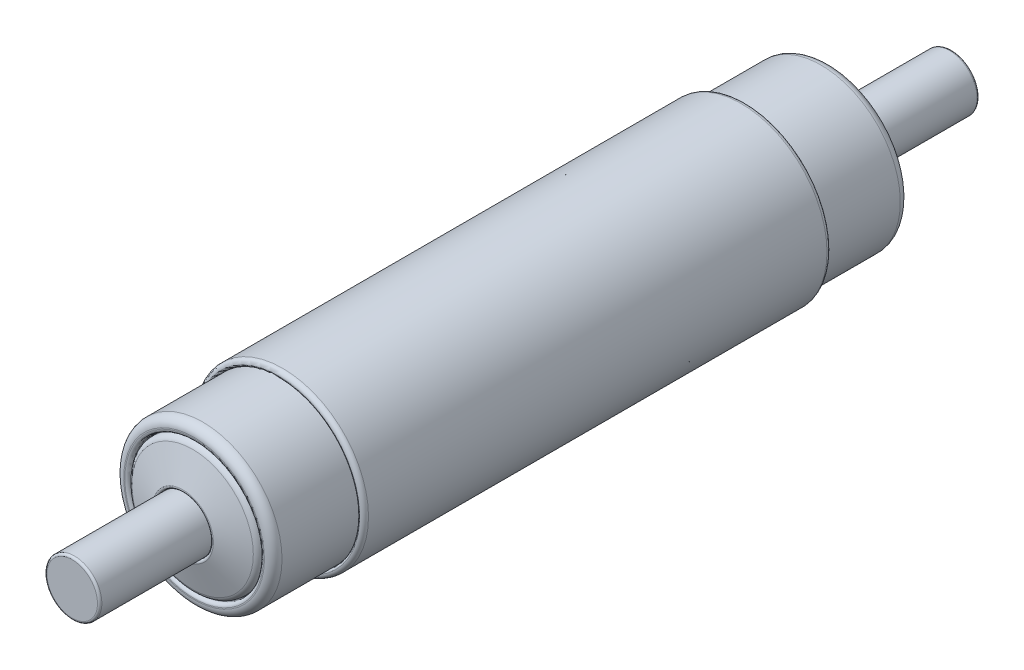
ISO-10303-21;
HEADER;
FILE_DESCRIPTION(('STEP AP214'),'2;1');
FILE_NAME('part.step','',(''),(''),'','','');
FILE_SCHEMA(('AUTOMOTIVE_DESIGN { 1 0 10303 214 1 1 1 1 }'));
ENDSEC;
DATA;
#1=APPLICATION_CONTEXT('core data for automotive mechanical design processes');
#2=APPLICATION_PROTOCOL_DEFINITION('international standard','automotive_design',2000,#1);
#3=PRODUCT_CONTEXT('',#1,'mechanical');
#4=PRODUCT('Part','Part','',(#3));
#5=PRODUCT_RELATED_PRODUCT_CATEGORY('part','',(#4));
#6=PRODUCT_DEFINITION_FORMATION('','',#4);
#7=PRODUCT_DEFINITION_CONTEXT('part definition',#1,'design');
#8=PRODUCT_DEFINITION('design','',#6,#7);
#9=PRODUCT_DEFINITION_SHAPE('','',#8);
#10=(LENGTH_UNIT() NAMED_UNIT(*) SI_UNIT(.MILLI.,.METRE.));
#11=(NAMED_UNIT(*) PLANE_ANGLE_UNIT() SI_UNIT($,.RADIAN.));
#12=(NAMED_UNIT(*) SI_UNIT($,.STERADIAN.) SOLID_ANGLE_UNIT());
#13=UNCERTAINTY_MEASURE_WITH_UNIT(LENGTH_MEASURE(1.E-05),#10,'distance_accuracy_value','');
#14=(GEOMETRIC_REPRESENTATION_CONTEXT(3) GLOBAL_UNCERTAINTY_ASSIGNED_CONTEXT((#13)) GLOBAL_UNIT_ASSIGNED_CONTEXT((#10,
#11,#12)) REPRESENTATION_CONTEXT('',''));
#15=CARTESIAN_POINT('',(0.,0.,0.));
#16=DIRECTION('',(0.,0.,1.));
#17=DIRECTION('',(1.,0.,0.));
#18=AXIS2_PLACEMENT_3D('',#15,#16,#17);
#19=CARTESIAN_POINT('',(0.,0.,36.7225226511455));
#20=DIRECTION('',(0.,0.,-1.));
#21=DIRECTION('',(0.,1.,0.));
#22=AXIS2_PLACEMENT_3D('',#19,#20,#21);
#23=CONICAL_SURFACE('',#22,7.54380000000002,1.26536370769589);
#24=CARTESIAN_POINT('',(0.,0.,37.995831815329));
#25=DIRECTION('',(0.,0.,1.));
#26=DIRECTION('',(0.,-1.,0.));
#27=AXIS2_PLACEMENT_3D('',#24,#25,#26);
#28=CIRCLE('',#27,3.50537927307408);
#29=CARTESIAN_POINT('',(0.,-3.50537927307408,37.995831815329));
#30=VERTEX_POINT('',#29);
#31=EDGE_CURVE('E11',#30,#30,#28,.F.);
#32=ORIENTED_EDGE('',*,*,#31,.T.);
#33=EDGE_LOOP('',(#32));
#34=FACE_BOUND('',#33,.T.);
#35=CARTESIAN_POINT('',(0.,0.,36.8905334513841));
#36=DIRECTION('',(0.,0.,1.));
#37=DIRECTION('',(0.,-1.,0.));
#38=AXIS2_PLACEMENT_3D('',#35,#36,#37);
#39=CIRCLE('',#38,7.01093781922228);
#40=CARTESIAN_POINT('',(0.,-7.01093781922227,36.8905334513841));
#41=VERTEX_POINT('',#40);
#42=EDGE_CURVE('E76',#41,#41,#39,.T.);
#43=ORIENTED_EDGE('',*,*,#42,.T.);
#44=EDGE_LOOP('',(#43));
#45=FACE_BOUND('',#44,.T.);
#46=ADVANCED_FACE('F50',(#34,#45),#23,.T.);
#47=CARTESIAN_POINT('',(0.,0.,50.8));
#48=DIRECTION('',(0.,0.,1.));
#49=DIRECTION('',(0.,-1.,0.));
#50=AXIS2_PLACEMENT_3D('',#47,#48,#49);
#51=CYLINDRICAL_SURFACE('',#50,7.54380000000002);
#52=CARTESIAN_POINT('',(0.,0.,-36.163801134914));
#53=DIRECTION('',(0.,0.,-1.));
#54=DIRECTION('',(0.,1.,0.));
#55=AXIS2_PLACEMENT_3D('',#52,#53,#54);
#56=CIRCLE('',#55,7.54380000000002);
#57=CARTESIAN_POINT('',(0.,7.54380000000003,-36.163801134914));
#58=VERTEX_POINT('',#57);
#59=EDGE_CURVE('E84',#58,#58,#56,.F.);
#60=ORIENTED_EDGE('',*,*,#59,.T.);
#61=EDGE_LOOP('',(#60));
#62=FACE_BOUND('',#61,.T.);
#63=CARTESIAN_POINT('',(0.,0.,36.163801134914));
#64=DIRECTION('',(0.,0.,-1.));
#65=DIRECTION('',(0.,1.,0.));
#66=AXIS2_PLACEMENT_3D('',#63,#64,#65);
#67=CIRCLE('',#66,7.54380000000002);
#68=CARTESIAN_POINT('',(0.,7.54380000000002,36.163801134914));
#69=VERTEX_POINT('',#68);
#70=EDGE_CURVE('E88',#69,#69,#67,.T.);
#71=ORIENTED_EDGE('',*,*,#70,.T.);
#72=EDGE_LOOP('',(#71));
#73=FACE_BOUND('',#72,.T.);
#74=ADVANCED_FACE('F94',(#62,#73),#51,.T.);
#75=CARTESIAN_POINT('',(0.,0.,-38.1));
#76=DIRECTION('',(0.,0.,1.));
#77=DIRECTION('',(0.,-1.,0.));
#78=AXIS2_PLACEMENT_3D('',#75,#76,#77);
#79=CONICAL_SURFACE('',#78,3.175,1.26536370769589);
#80=CARTESIAN_POINT('',(0.,0.,-37.995831815329));
#81=DIRECTION('',(0.,0.,-1.));
#82=DIRECTION('',(0.,1.,0.));
#83=AXIS2_PLACEMENT_3D('',#80,#81,#82);
#84=CIRCLE('',#83,3.50537927307408);
#85=CARTESIAN_POINT('',(0.,3.50537927307409,-37.995831815329));
#86=VERTEX_POINT('',#85);
#87=EDGE_CURVE('E70',#86,#86,#84,.F.);
#88=ORIENTED_EDGE('',*,*,#87,.T.);
#89=EDGE_LOOP('',(#88));
#90=FACE_BOUND('',#89,.T.);
#91=CARTESIAN_POINT('',(0.,0.,-36.8905334513841));
#92=DIRECTION('',(0.,0.,-1.));
#93=DIRECTION('',(0.,1.,0.));
#94=AXIS2_PLACEMENT_3D('',#91,#92,#93);
#95=CIRCLE('',#94,7.01093781922228);
#96=CARTESIAN_POINT('',(0.,7.01093781922229,-36.8905334513841));
#97=VERTEX_POINT('',#96);
#98=EDGE_CURVE('E80',#97,#97,#95,.T.);
#99=ORIENTED_EDGE('',*,*,#98,.T.);
#100=EDGE_LOOP('',(#99));
#101=FACE_BOUND('',#100,.T.);
#102=ADVANCED_FACE('F109',(#90,#101),#79,.T.);
#103=CARTESIAN_POINT('',(0.,0.,50.8));
#104=DIRECTION('',(0.,0.,1.));
#105=DIRECTION('',(0.,-1.,0.));
#106=AXIS2_PLACEMENT_3D('',#103,#104,#105);
#107=CYLINDRICAL_SURFACE('',#106,3.175);
#108=CARTESIAN_POINT('',(0.,0.,-37.753587709839));
#109=DIRECTION('',(0.,0.,-1.));
#110=DIRECTION('',(0.,1.,0.));
#111=AXIS2_PLACEMENT_3D('',#108,#109,#110);
#112=CIRCLE('',#111,3.175);
#113=CARTESIAN_POINT('',(0.,3.17500000000001,-37.753587709839));
#114=VERTEX_POINT('',#113);
#115=EDGE_CURVE('E58',#114,#114,#112,.T.);
#116=ORIENTED_EDGE('',*,*,#115,.T.);
#117=EDGE_LOOP('',(#116));
#118=FACE_BOUND('',#117,.T.);
#119=CARTESIAN_POINT('',(0.,0.,37.753587709839));
#120=DIRECTION('',(0.,0.,-1.));
#121=DIRECTION('',(0.,1.,0.));
#122=AXIS2_PLACEMENT_3D('',#119,#120,#121);
#123=CIRCLE('',#122,3.175);
#124=CARTESIAN_POINT('',(0.,3.175,37.753587709839));
#125=VERTEX_POINT('',#124);
#126=EDGE_CURVE('E64',#125,#125,#123,.F.);
#127=ORIENTED_EDGE('',*,*,#126,.T.);
#128=EDGE_LOOP('',(#127));
#129=FACE_BOUND('',#128,.T.);
#130=ADVANCED_FACE('F115',(#118,#129),#107,.F.);
#131=CARTESIAN_POINT('',(0.,0.,-36.163801134914));
#132=DIRECTION('',(0.,0.,-1.));
#133=DIRECTION('',(0.,1.,0.));
#134=AXIS2_PLACEMENT_3D('',#131,#132,#133);
#135=TOROIDAL_SURFACE('',#134,6.78180000000002,0.762);
#136=ORIENTED_EDGE('',*,*,#98,.F.);
#137=EDGE_LOOP('',(#136));
#138=FACE_BOUND('',#137,.T.);
#139=ORIENTED_EDGE('',*,*,#59,.F.);
#140=EDGE_LOOP('',(#139));
#141=FACE_BOUND('',#140,.T.);
#142=ADVANCED_FACE('F100',(#138,#141),#135,.T.);
#143=CARTESIAN_POINT('',(0.,0.,36.163801134914));
#144=DIRECTION('',(0.,0.,-1.));
#145=DIRECTION('',(0.,1.,0.));
#146=AXIS2_PLACEMENT_3D('',#143,#144,#145);
#147=TOROIDAL_SURFACE('',#146,6.78180000000002,0.762);
#148=ORIENTED_EDGE('',*,*,#70,.F.);
#149=EDGE_LOOP('',(#148));
#150=FACE_BOUND('',#149,.T.);
#151=ORIENTED_EDGE('',*,*,#42,.F.);
#152=EDGE_LOOP('',(#151));
#153=FACE_BOUND('',#152,.T.);
#154=ADVANCED_FACE('F96',(#150,#153),#147,.T.);
#155=CARTESIAN_POINT('',(0.,0.,-37.753587709839));
#156=DIRECTION('',(0.,0.,-1.));
#157=DIRECTION('',(0.,1.,0.));
#158=AXIS2_PLACEMENT_3D('',#155,#156,#157);
#159=TOROIDAL_SURFACE('',#158,3.429,0.254);
#160=ORIENTED_EDGE('',*,*,#115,.F.);
#161=EDGE_LOOP('',(#160));
#162=FACE_BOUND('',#161,.T.);
#163=ORIENTED_EDGE('',*,*,#87,.F.);
#164=EDGE_LOOP('',(#163));
#165=FACE_BOUND('',#164,.T.);
#166=ADVANCED_FACE('F99',(#162,#165),#159,.T.);
#167=CARTESIAN_POINT('',(0.,0.,37.753587709839));
#168=DIRECTION('',(0.,0.,-1.));
#169=DIRECTION('',(0.,1.,0.));
#170=AXIS2_PLACEMENT_3D('',#167,#168,#169);
#171=TOROIDAL_SURFACE('',#170,3.429,0.254);
#172=ORIENTED_EDGE('',*,*,#31,.F.);
#173=EDGE_LOOP('',(#172));
#174=FACE_BOUND('',#173,.T.);
#175=ORIENTED_EDGE('',*,*,#126,.F.);
#176=EDGE_LOOP('',(#175));
#177=FACE_BOUND('',#176,.T.);
#178=ADVANCED_FACE('F52',(#174,#177),#171,.T.);
#179=CLOSED_SHELL('',(#46,#74,#102,#130,#142,#154,#166,#178));
#180=MANIFOLD_SOLID_BREP('B2',#179);
#181=CARTESIAN_POINT('',(0.,7.62000000000003,-36.7225226511455));
#182=DIRECTION('',(0.,0.,1.));
#183=DIRECTION('',(0.,-1.,0.));
#184=AXIS2_PLACEMENT_3D('',#181,#182,#183);
#185=PLANE('',#184);
#186=CARTESIAN_POINT('',(0.,0.,-36.7225226511455));
#187=DIRECTION('',(0.,0.,1.));
#188=DIRECTION('',(0.,-1.,0.));
#189=AXIS2_PLACEMENT_3D('',#186,#187,#188);
#190=CIRCLE('',#189,8.00100000000002);
#191=CARTESIAN_POINT('',(0.,-8.00100000000001,-36.7225226511455));
#192=VERTEX_POINT('',#191);
#193=EDGE_CURVE('E49',#192,#192,#190,.T.);
#194=ORIENTED_EDGE('',*,*,#193,.T.);
#195=EDGE_LOOP('',(#194));
#196=FACE_BOUND('',#195,.T.);
#197=CARTESIAN_POINT('',(0.,0.,-36.7225226511455));
#198=DIRECTION('',(0.,0.,1.));
#199=DIRECTION('',(0.,-1.,0.));
#200=AXIS2_PLACEMENT_3D('',#197,#198,#199);
#201=CIRCLE('',#200,8.12800000000003);
#202=CARTESIAN_POINT('',(0.,-8.12800000000002,-36.7225226511455));
#203=VERTEX_POINT('',#202);
#204=EDGE_CURVE('E226',#203,#203,#201,.F.);
#205=ORIENTED_EDGE('',*,*,#204,.T.);
#206=EDGE_LOOP('',(#205));
#207=FACE_BOUND('',#206,.T.);
#208=ADVANCED_FACE('F196',(#196,#207),#185,.F.);
#209=CARTESIAN_POINT('',(0.,0.,50.8));
#210=DIRECTION('',(0.,0.,1.));
#211=DIRECTION('',(0.,-1.,0.));
#212=AXIS2_PLACEMENT_3D('',#209,#210,#211);
#213=CYLINDRICAL_SURFACE('',#212,9.14400000000003);
#214=CARTESIAN_POINT('',(0.,0.,-35.7065226511455));
#215=DIRECTION('',(0.,0.,1.));
#216=DIRECTION('',(0.,-1.,0.));
#217=AXIS2_PLACEMENT_3D('',#214,#215,#216);
#218=CIRCLE('',#217,9.14400000000003);
#219=CARTESIAN_POINT('',(0.,-9.14400000000002,-35.7065226511455));
#220=VERTEX_POINT('',#219);
#221=EDGE_CURVE('E230',#220,#220,#218,.T.);
#222=ORIENTED_EDGE('',*,*,#221,.T.);
#223=EDGE_LOOP('',(#222));
#224=FACE_BOUND('',#223,.T.);
#225=CARTESIAN_POINT('',(0.,0.,35.7065226511455));
#226=DIRECTION('',(0.,0.,-1.));
#227=DIRECTION('',(0.,1.,0.));
#228=AXIS2_PLACEMENT_3D('',#225,#226,#227);
#229=CIRCLE('',#228,9.14400000000003);
#230=CARTESIAN_POINT('',(0.,9.14400000000003,35.7065226511455));
#231=VERTEX_POINT('',#230);
#232=EDGE_CURVE('E234',#231,#231,#229,.T.);
#233=ORIENTED_EDGE('',*,*,#232,.T.);
#234=EDGE_LOOP('',(#233));
#235=FACE_BOUND('',#234,.T.);
#236=ADVANCED_FACE('F240',(#224,#235),#213,.T.);
#237=CARTESIAN_POINT('',(0.,9.14400000000003,36.7225226511455));
#238=DIRECTION('',(0.,0.,-1.));
#239=DIRECTION('',(0.,1.,0.));
#240=AXIS2_PLACEMENT_3D('',#237,#238,#239);
#241=PLANE('',#240);
#242=CARTESIAN_POINT('',(0.,0.,36.7225226511455));
#243=DIRECTION('',(0.,0.,-1.));
#244=DIRECTION('',(0.,1.,0.));
#245=AXIS2_PLACEMENT_3D('',#242,#243,#244);
#246=CIRCLE('',#245,8.00100000000002);
#247=CARTESIAN_POINT('',(0.,8.00100000000002,36.7225226511455));
#248=VERTEX_POINT('',#247);
#249=EDGE_CURVE('E204',#248,#248,#246,.T.);
#250=ORIENTED_EDGE('',*,*,#249,.T.);
#251=EDGE_LOOP('',(#250));
#252=FACE_BOUND('',#251,.T.);
#253=CARTESIAN_POINT('',(0.,0.,36.7225226511455));
#254=DIRECTION('',(0.,0.,-1.));
#255=DIRECTION('',(0.,1.,0.));
#256=AXIS2_PLACEMENT_3D('',#253,#254,#255);
#257=CIRCLE('',#256,8.12800000000003);
#258=CARTESIAN_POINT('',(0.,8.12800000000003,36.7225226511455));
#259=VERTEX_POINT('',#258);
#260=EDGE_CURVE('E222',#259,#259,#257,.F.);
#261=ORIENTED_EDGE('',*,*,#260,.T.);
#262=EDGE_LOOP('',(#261));
#263=FACE_BOUND('',#262,.T.);
#264=ADVANCED_FACE('F250',(#252,#263),#241,.F.);
#265=CARTESIAN_POINT('',(0.,0.,50.8));
#266=DIRECTION('',(0.,0.,1.));
#267=DIRECTION('',(0.,-1.,0.));
#268=AXIS2_PLACEMENT_3D('',#265,#266,#267);
#269=CYLINDRICAL_SURFACE('',#268,7.62000000000002);
#270=CARTESIAN_POINT('',(0.,0.,36.3415226511455));
#271=DIRECTION('',(0.,0.,-1.));
#272=DIRECTION('',(0.,1.,0.));
#273=AXIS2_PLACEMENT_3D('',#270,#271,#272);
#274=CIRCLE('',#273,7.62000000000002);
#275=CARTESIAN_POINT('',(0.,7.62000000000002,36.3415226511455));
#276=VERTEX_POINT('',#275);
#277=EDGE_CURVE('E210',#276,#276,#274,.F.);
#278=ORIENTED_EDGE('',*,*,#277,.T.);
#279=EDGE_LOOP('',(#278));
#280=FACE_BOUND('',#279,.T.);
#281=CARTESIAN_POINT('',(0.,0.,-36.3415226511455));
#282=DIRECTION('',(0.,0.,1.));
#283=DIRECTION('',(0.,-1.,0.));
#284=AXIS2_PLACEMENT_3D('',#281,#282,#283);
#285=CIRCLE('',#284,7.62000000000002);
#286=CARTESIAN_POINT('',(0.,-7.62000000000001,-36.3415226511455));
#287=VERTEX_POINT('',#286);
#288=EDGE_CURVE('E216',#287,#287,#285,.F.);
#289=ORIENTED_EDGE('',*,*,#288,.T.);
#290=EDGE_LOOP('',(#289));
#291=FACE_BOUND('',#290,.T.);
#292=ADVANCED_FACE('F252',(#280,#291),#269,.F.);
#293=CARTESIAN_POINT('',(0.,0.,-35.7065226511455));
#294=DIRECTION('',(0.,0.,1.));
#295=DIRECTION('',(0.,-1.,0.));
#296=AXIS2_PLACEMENT_3D('',#293,#294,#295);
#297=TOROIDAL_SURFACE('',#296,8.12800000000003,1.016);
#298=ORIENTED_EDGE('',*,*,#204,.F.);
#299=EDGE_LOOP('',(#298));
#300=FACE_BOUND('',#299,.T.);
#301=ORIENTED_EDGE('',*,*,#221,.F.);
#302=EDGE_LOOP('',(#301));
#303=FACE_BOUND('',#302,.T.);
#304=ADVANCED_FACE('F246',(#300,#303),#297,.T.);
#305=CARTESIAN_POINT('',(0.,0.,35.7065226511455));
#306=DIRECTION('',(0.,0.,-1.));
#307=DIRECTION('',(0.,1.,0.));
#308=AXIS2_PLACEMENT_3D('',#305,#306,#307);
#309=TOROIDAL_SURFACE('',#308,8.12800000000003,1.016);
#310=ORIENTED_EDGE('',*,*,#232,.F.);
#311=EDGE_LOOP('',(#310));
#312=FACE_BOUND('',#311,.T.);
#313=ORIENTED_EDGE('',*,*,#260,.F.);
#314=EDGE_LOOP('',(#313));
#315=FACE_BOUND('',#314,.T.);
#316=ADVANCED_FACE('F242',(#312,#315),#309,.T.);
#317=CARTESIAN_POINT('',(0.,0.,36.3415226511455));
#318=DIRECTION('',(0.,0.,-1.));
#319=DIRECTION('',(0.,1.,0.));
#320=AXIS2_PLACEMENT_3D('',#317,#318,#319);
#321=TOROIDAL_SURFACE('',#320,8.00100000000002,0.381);
#322=ORIENTED_EDGE('',*,*,#249,.F.);
#323=EDGE_LOOP('',(#322));
#324=FACE_BOUND('',#323,.T.);
#325=ORIENTED_EDGE('',*,*,#277,.F.);
#326=EDGE_LOOP('',(#325));
#327=FACE_BOUND('',#326,.T.);
#328=ADVANCED_FACE('F245',(#324,#327),#321,.T.);
#329=CARTESIAN_POINT('',(0.,0.,-36.3415226511455));
#330=DIRECTION('',(0.,0.,1.));
#331=DIRECTION('',(0.,-1.,0.));
#332=AXIS2_PLACEMENT_3D('',#329,#330,#331);
#333=TOROIDAL_SURFACE('',#332,8.00100000000002,0.381);
#334=ORIENTED_EDGE('',*,*,#288,.F.);
#335=EDGE_LOOP('',(#334));
#336=FACE_BOUND('',#335,.T.);
#337=ORIENTED_EDGE('',*,*,#193,.F.);
#338=EDGE_LOOP('',(#337));
#339=FACE_BOUND('',#338,.T.);
#340=ADVANCED_FACE('F198',(#336,#339),#333,.T.);
#341=CLOSED_SHELL('',(#208,#236,#264,#292,#304,#316,#328,#340));
#342=MANIFOLD_SOLID_BREP('B6',#341);
#343=CARTESIAN_POINT('',(0.,0.,50.8));
#344=DIRECTION('',(0.,0.,1.));
#345=DIRECTION('',(1.,0.,0.));
#346=AXIS2_PLACEMENT_3D('',#343,#344,#345);
#347=CYLINDRICAL_SURFACE('',#346,9.14400000000002);
#348=CARTESIAN_POINT('',(0.,0.,26.7335));
#349=DIRECTION('',(0.,0.,-1.));
#350=DIRECTION('',(-1.,0.,0.));
#351=AXIS2_PLACEMENT_3D('',#348,#349,#350);
#352=CIRCLE('',#351,9.14400000000002);
#353=CARTESIAN_POINT('',(-9.14400000000002,0.,26.7335));
#354=VERTEX_POINT('',#353);
#355=EDGE_CURVE('E195',#354,#354,#352,.F.);
#356=ORIENTED_EDGE('',*,*,#355,.T.);
#357=EDGE_LOOP('',(#356));
#358=FACE_BOUND('',#357,.T.);
#359=CARTESIAN_POINT('',(0.,0.,-26.7335));
#360=DIRECTION('',(0.,0.,1.));
#361=DIRECTION('',(1.,0.,0.));
#362=AXIS2_PLACEMENT_3D('',#359,#360,#361);
#363=CIRCLE('',#362,9.14400000000002);
#364=CARTESIAN_POINT('',(9.14400000000002,0.,-26.7335));
#365=VERTEX_POINT('',#364);
#366=EDGE_CURVE('E349',#365,#365,#363,.F.);
#367=ORIENTED_EDGE('',*,*,#366,.T.);
#368=EDGE_LOOP('',(#367));
#369=FACE_BOUND('',#368,.T.);
#370=ADVANCED_FACE('F341',(#358,#369),#347,.F.);
#371=CARTESIAN_POINT('',(0.,0.,50.8));
#372=DIRECTION('',(0.,0.,1.));
#373=DIRECTION('',(1.,0.,0.));
#374=AXIS2_PLACEMENT_3D('',#371,#372,#373);
#375=CYLINDRICAL_SURFACE('',#374,9.90599999999998);
#376=CARTESIAN_POINT('',(0.,0.,-26.4795));
#377=DIRECTION('',(0.,0.,1.));
#378=DIRECTION('',(1.,0.,0.));
#379=AXIS2_PLACEMENT_3D('',#376,#377,#378);
#380=CIRCLE('',#379,9.90599999999998);
#381=CARTESIAN_POINT('',(9.90599999999998,0.,-26.4795));
#382=VERTEX_POINT('',#381);
#383=EDGE_CURVE('E367',#382,#382,#380,.T.);
#384=ORIENTED_EDGE('',*,*,#383,.T.);
#385=EDGE_LOOP('',(#384));
#386=FACE_BOUND('',#385,.T.);
#387=CARTESIAN_POINT('',(0.,0.,26.4795));
#388=DIRECTION('',(0.,0.,-1.));
#389=DIRECTION('',(-1.,0.,0.));
#390=AXIS2_PLACEMENT_3D('',#387,#388,#389);
#391=CIRCLE('',#390,9.90599999999998);
#392=CARTESIAN_POINT('',(-9.90599999999998,0.,26.4795));
#393=VERTEX_POINT('',#392);
#394=EDGE_CURVE('E371',#393,#393,#391,.T.);
#395=ORIENTED_EDGE('',*,*,#394,.T.);
#396=EDGE_LOOP('',(#395));
#397=FACE_BOUND('',#396,.T.);
#398=ADVANCED_FACE('F377',(#386,#397),#375,.T.);
#399=CARTESIAN_POINT('',(0.,0.,-26.4795));
#400=DIRECTION('',(0.,0.,1.));
#401=DIRECTION('',(1.,0.,0.));
#402=AXIS2_PLACEMENT_3D('',#399,#400,#401);
#403=TOROIDAL_SURFACE('',#402,9.39799999999998,0.508);
#404=CARTESIAN_POINT('',(0.,0.,-26.9875));
#405=DIRECTION('',(0.,0.,1.));
#406=DIRECTION('',(1.,0.,0.));
#407=AXIS2_PLACEMENT_3D('',#404,#405,#406);
#408=CIRCLE('',#407,9.39799999999998);
#409=CARTESIAN_POINT('',(9.39799999999998,0.,-26.9875));
#410=VERTEX_POINT('',#409);
#411=EDGE_CURVE('E361',#410,#410,#408,.F.);
#412=ORIENTED_EDGE('',*,*,#411,.F.);
#413=EDGE_LOOP('',(#412));
#414=FACE_BOUND('',#413,.T.);
#415=ORIENTED_EDGE('',*,*,#383,.F.);
#416=EDGE_LOOP('',(#415));
#417=FACE_BOUND('',#416,.T.);
#418=ADVANCED_FACE('F383',(#414,#417),#403,.T.);
#419=CARTESIAN_POINT('',(0.,0.,26.4795));
#420=DIRECTION('',(0.,0.,-1.));
#421=DIRECTION('',(-1.,0.,0.));
#422=AXIS2_PLACEMENT_3D('',#419,#420,#421);
#423=TOROIDAL_SURFACE('',#422,9.39799999999998,0.508);
#424=ORIENTED_EDGE('',*,*,#394,.F.);
#425=EDGE_LOOP('',(#424));
#426=FACE_BOUND('',#425,.T.);
#427=CARTESIAN_POINT('',(0.,0.,26.9875));
#428=DIRECTION('',(0.,0.,-1.));
#429=DIRECTION('',(-1.,0.,0.));
#430=AXIS2_PLACEMENT_3D('',#427,#428,#429);
#431=CIRCLE('',#430,9.39799999999998);
#432=CARTESIAN_POINT('',(-9.39799999999998,0.,26.9875));
#433=VERTEX_POINT('',#432);
#434=EDGE_CURVE('E355',#433,#433,#431,.F.);
#435=ORIENTED_EDGE('',*,*,#434,.F.);
#436=EDGE_LOOP('',(#435));
#437=FACE_BOUND('',#436,.T.);
#438=ADVANCED_FACE('F379',(#426,#437),#423,.T.);
#439=CARTESIAN_POINT('',(0.,0.,26.7335));
#440=DIRECTION('',(0.,0.,-1.));
#441=DIRECTION('',(-1.,0.,0.));
#442=AXIS2_PLACEMENT_3D('',#439,#440,#441);
#443=TOROIDAL_SURFACE('',#442,9.39800000000002,0.254);
#444=ORIENTED_EDGE('',*,*,#434,.T.);
#445=EDGE_LOOP('',(#444));
#446=FACE_BOUND('',#445,.T.);
#447=ORIENTED_EDGE('',*,*,#355,.F.);
#448=EDGE_LOOP('',(#447));
#449=FACE_BOUND('',#448,.T.);
#450=ADVANCED_FACE('F382',(#446,#449),#443,.T.);
#451=CARTESIAN_POINT('',(0.,0.,-26.7335));
#452=DIRECTION('',(0.,0.,1.));
#453=DIRECTION('',(1.,0.,0.));
#454=AXIS2_PLACEMENT_3D('',#451,#452,#453);
#455=TOROIDAL_SURFACE('',#454,9.39800000000002,0.254);
#456=ORIENTED_EDGE('',*,*,#366,.F.);
#457=EDGE_LOOP('',(#456));
#458=FACE_BOUND('',#457,.T.);
#459=ORIENTED_EDGE('',*,*,#411,.T.);
#460=EDGE_LOOP('',(#459));
#461=FACE_BOUND('',#460,.T.);
#462=ADVANCED_FACE('F343',(#458,#461),#455,.T.);
#463=CLOSED_SHELL('',(#370,#398,#418,#438,#450,#462));
#464=MANIFOLD_SOLID_BREP('B44',#463);
#465=CARTESIAN_POINT('',(0.,3.175,50.8));
#466=DIRECTION('',(0.,0.,-1.));
#467=DIRECTION('',(-1.,0.,0.));
#468=AXIS2_PLACEMENT_3D('',#465,#466,#467);
#469=PLANE('',#468);
#470=CARTESIAN_POINT('',(0.,0.,50.8));
#471=DIRECTION('',(0.,0.,-1.));
#472=DIRECTION('',(-1.,0.,0.));
#473=AXIS2_PLACEMENT_3D('',#470,#471,#472);
#474=CIRCLE('',#473,2.92099999999999);
#475=CARTESIAN_POINT('',(-2.92099999999999,0.,50.8));
#476=VERTEX_POINT('',#475);
#477=EDGE_CURVE('E340',#476,#476,#474,.F.);
#478=ORIENTED_EDGE('',*,*,#477,.T.);
#479=EDGE_LOOP('',(#478));
#480=FACE_BOUND('',#479,.T.);
#481=ADVANCED_FACE('F445',(#480),#469,.F.);
#482=CARTESIAN_POINT('',(0.,3.175,-50.8));
#483=DIRECTION('',(0.,0.,1.));
#484=DIRECTION('',(1.,0.,0.));
#485=AXIS2_PLACEMENT_3D('',#482,#483,#484);
#486=PLANE('',#485);
#487=CARTESIAN_POINT('',(0.,0.,-50.8));
#488=DIRECTION('',(0.,0.,1.));
#489=DIRECTION('',(1.,0.,0.));
#490=AXIS2_PLACEMENT_3D('',#487,#488,#489);
#491=CIRCLE('',#490,2.92099999999999);
#492=CARTESIAN_POINT('',(2.92099999999999,0.,-50.8));
#493=VERTEX_POINT('',#492);
#494=EDGE_CURVE('E453',#493,#493,#491,.F.);
#495=ORIENTED_EDGE('',*,*,#494,.T.);
#496=EDGE_LOOP('',(#495));
#497=FACE_BOUND('',#496,.T.);
#498=ADVANCED_FACE('F483',(#497),#486,.F.);
#499=CARTESIAN_POINT('',(0.,0.,50.8));
#500=DIRECTION('',(0.,0.,1.));
#501=DIRECTION('',(1.,0.,0.));
#502=AXIS2_PLACEMENT_3D('',#499,#500,#501);
#503=CYLINDRICAL_SURFACE('',#502,3.17499999999999);
#504=CARTESIAN_POINT('',(0.,0.,-50.546));
#505=DIRECTION('',(0.,0.,1.));
#506=DIRECTION('',(1.,0.,0.));
#507=AXIS2_PLACEMENT_3D('',#504,#505,#506);
#508=CIRCLE('',#507,3.17499999999999);
#509=CARTESIAN_POINT('',(3.17499999999999,0.,-50.546));
#510=VERTEX_POINT('',#509);
#511=EDGE_CURVE('E459',#510,#510,#508,.T.);
#512=ORIENTED_EDGE('',*,*,#511,.T.);
#513=EDGE_LOOP('',(#512));
#514=FACE_BOUND('',#513,.T.);
#515=CARTESIAN_POINT('',(0.,0.,50.546));
#516=DIRECTION('',(0.,0.,-1.));
#517=DIRECTION('',(-1.,0.,0.));
#518=AXIS2_PLACEMENT_3D('',#515,#516,#517);
#519=CIRCLE('',#518,3.17499999999999);
#520=CARTESIAN_POINT('',(-3.17499999999999,0.,50.546));
#521=VERTEX_POINT('',#520);
#522=EDGE_CURVE('E465',#521,#521,#519,.T.);
#523=ORIENTED_EDGE('',*,*,#522,.T.);
#524=EDGE_LOOP('',(#523));
#525=FACE_BOUND('',#524,.T.);
#526=ADVANCED_FACE('F473',(#514,#525),#503,.T.);
#527=CARTESIAN_POINT('',(0.,0.,-50.546));
#528=DIRECTION('',(0.,0.,1.));
#529=DIRECTION('',(1.,0.,0.));
#530=AXIS2_PLACEMENT_3D('',#527,#528,#529);
#531=TOROIDAL_SURFACE('',#530,2.92099999999999,0.254);
#532=ORIENTED_EDGE('',*,*,#494,.F.);
#533=EDGE_LOOP('',(#532));
#534=FACE_BOUND('',#533,.T.);
#535=ORIENTED_EDGE('',*,*,#511,.F.);
#536=EDGE_LOOP('',(#535));
#537=FACE_BOUND('',#536,.T.);
#538=ADVANCED_FACE('F477',(#534,#537),#531,.T.);
#539=CARTESIAN_POINT('',(0.,0.,50.546));
#540=DIRECTION('',(0.,0.,-1.));
#541=DIRECTION('',(-1.,0.,0.));
#542=AXIS2_PLACEMENT_3D('',#539,#540,#541);
#543=TOROIDAL_SURFACE('',#542,2.92099999999999,0.254);
#544=ORIENTED_EDGE('',*,*,#522,.F.);
#545=EDGE_LOOP('',(#544));
#546=FACE_BOUND('',#545,.T.);
#547=ORIENTED_EDGE('',*,*,#477,.F.);
#548=EDGE_LOOP('',(#547));
#549=FACE_BOUND('',#548,.T.);
#550=ADVANCED_FACE('F447',(#546,#549),#543,.T.);
#551=CLOSED_SHELL('',(#481,#498,#526,#538,#550));
#552=MANIFOLD_SOLID_BREP('B190',#551);
#553=ADVANCED_BREP_SHAPE_REPRESENTATION('',(#18,#180,#342,#464,#552),#14);
#554=SHAPE_DEFINITION_REPRESENTATION(#9,#553);
ENDSEC;
END-ISO-10303-21;
